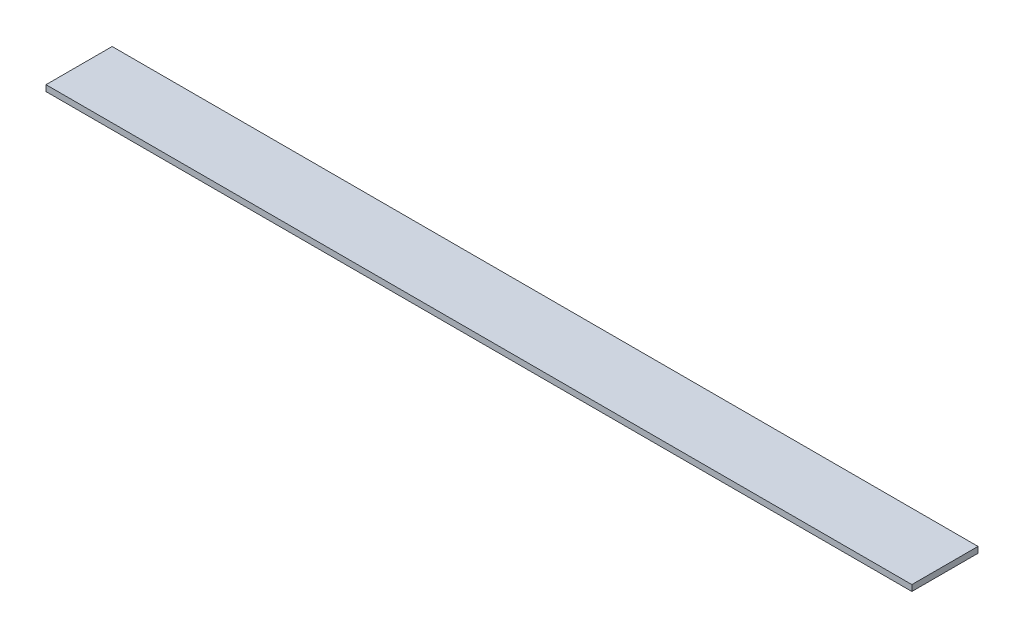
ISO-10303-21;
HEADER;
FILE_DESCRIPTION(('STEP AP214'),'2;1');
FILE_NAME('part.step','',(''),(''),'','','');
FILE_SCHEMA(('AUTOMOTIVE_DESIGN { 1 0 10303 214 1 1 1 1 }'));
ENDSEC;
DATA;
#1=APPLICATION_CONTEXT('core data for automotive mechanical design processes');
#2=APPLICATION_PROTOCOL_DEFINITION('international standard','automotive_design',2000,#1);
#3=PRODUCT_CONTEXT('',#1,'mechanical');
#4=PRODUCT('Part','Part','',(#3));
#5=PRODUCT_RELATED_PRODUCT_CATEGORY('part','',(#4));
#6=PRODUCT_DEFINITION_FORMATION('','',#4);
#7=PRODUCT_DEFINITION_CONTEXT('part definition',#1,'design');
#8=PRODUCT_DEFINITION('design','',#6,#7);
#9=PRODUCT_DEFINITION_SHAPE('','',#8);
#10=(LENGTH_UNIT() NAMED_UNIT(*) SI_UNIT(.MILLI.,.METRE.));
#11=(NAMED_UNIT(*) PLANE_ANGLE_UNIT() SI_UNIT($,.RADIAN.));
#12=(NAMED_UNIT(*) SI_UNIT($,.STERADIAN.) SOLID_ANGLE_UNIT());
#13=UNCERTAINTY_MEASURE_WITH_UNIT(LENGTH_MEASURE(1.E-05),#10,'distance_accuracy_value','');
#14=(GEOMETRIC_REPRESENTATION_CONTEXT(3) GLOBAL_UNCERTAINTY_ASSIGNED_CONTEXT((#13)) GLOBAL_UNIT_ASSIGNED_CONTEXT((#10,
#11,#12)) REPRESENTATION_CONTEXT('',''));
#15=CARTESIAN_POINT('',(0.,0.,0.));
#16=DIRECTION('',(0.,0.,1.));
#17=DIRECTION('',(1.,0.,0.));
#18=AXIS2_PLACEMENT_3D('',#15,#16,#17);
#19=CARTESIAN_POINT('',(-39.5347936844725,12.7,-106.008399092792));
#20=DIRECTION('',(1.,0.,0.));
#21=DIRECTION('',(0.,0.,-1.));
#22=AXIS2_PLACEMENT_3D('',#19,#20,#21);
#23=PLANE('',#22);
#24=DIRECTION('',(0.,0.,1.));
#25=VECTOR('',#24,1.);
#26=CARTESIAN_POINT('',(-39.5347936844725,0.,-106.008399092792));
#27=LINE('',#26,#25);
#28=CARTESIAN_POINT('',(-39.5347936844725,0.,-106.008399092792));
#29=VERTEX_POINT('',#28);
#30=CARTESIAN_POINT('',(-39.5347936844725,0.,33.6916009072077));
#31=VERTEX_POINT('',#30);
#32=EDGE_CURVE('E96',#29,#31,#27,.T.);
#33=ORIENTED_EDGE('',*,*,#32,.T.);
#34=DIRECTION('',(0.,-1.,0.));
#35=VECTOR('',#34,1.);
#36=CARTESIAN_POINT('',(-39.5347936844725,12.7,33.6916009072077));
#37=LINE('',#36,#35);
#38=CARTESIAN_POINT('',(-39.5347936844725,12.7,33.6916009072077));
#39=VERTEX_POINT('',#38);
#40=EDGE_CURVE('E11',#39,#31,#37,.T.);
#41=ORIENTED_EDGE('',*,*,#40,.F.);
#42=DIRECTION('',(0.,0.,1.));
#43=VECTOR('',#42,1.);
#44=CARTESIAN_POINT('',(-39.5347936844725,12.7,-106.008399092792));
#45=LINE('',#44,#43);
#46=CARTESIAN_POINT('',(-39.5347936844725,12.7,-106.008399092792));
#47=VERTEX_POINT('',#46);
#48=EDGE_CURVE('E84',#47,#39,#45,.T.);
#49=ORIENTED_EDGE('',*,*,#48,.F.);
#50=DIRECTION('',(0.,-1.,0.));
#51=VECTOR('',#50,1.);
#52=CARTESIAN_POINT('',(-39.5347936844725,12.7,-106.008399092792));
#53=LINE('',#52,#51);
#54=EDGE_CURVE('E92',#47,#29,#53,.T.);
#55=ORIENTED_EDGE('',*,*,#54,.T.);
#56=EDGE_LOOP('',(#33,#41,#49,#55));
#57=FACE_BOUND('',#56,.T.);
#58=ADVANCED_FACE('F33',(#57),#23,.F.);
#59=CARTESIAN_POINT('',(-39.5347936844725,12.7,33.6916009072077));
#60=DIRECTION('',(0.,0.,-1.));
#61=DIRECTION('',(-1.,0.,0.));
#62=AXIS2_PLACEMENT_3D('',#59,#60,#61);
#63=PLANE('',#62);
#64=DIRECTION('',(1.,0.,0.));
#65=VECTOR('',#64,1.);
#66=CARTESIAN_POINT('',(-39.5347936844725,0.,33.6916009072077));
#67=LINE('',#66,#65);
#68=CARTESIAN_POINT('',(1789.26520631553,0.,33.6916009072077));
#69=VERTEX_POINT('',#68);
#70=EDGE_CURVE('E88',#31,#69,#67,.T.);
#71=ORIENTED_EDGE('',*,*,#70,.T.);
#72=DIRECTION('',(0.,-1.,0.));
#73=VECTOR('',#72,1.);
#74=CARTESIAN_POINT('',(1789.26520631553,12.7,33.6916009072077));
#75=LINE('',#74,#73);
#76=CARTESIAN_POINT('',(1789.26520631553,12.7,33.6916009072077));
#77=VERTEX_POINT('',#76);
#78=EDGE_CURVE('E41',#77,#69,#75,.T.);
#79=ORIENTED_EDGE('',*,*,#78,.F.);
#80=DIRECTION('',(1.,0.,0.));
#81=VECTOR('',#80,1.);
#82=CARTESIAN_POINT('',(-39.5347936844725,12.7,33.6916009072077));
#83=LINE('',#82,#81);
#84=EDGE_CURVE('E79',#39,#77,#83,.T.);
#85=ORIENTED_EDGE('',*,*,#84,.F.);
#86=ORIENTED_EDGE('',*,*,#40,.T.);
#87=EDGE_LOOP('',(#71,#79,#85,#86));
#88=FACE_BOUND('',#87,.T.);
#89=ADVANCED_FACE('F87',(#88),#63,.F.);
#90=CARTESIAN_POINT('',(1789.26520631553,12.7,-106.008399092792));
#91=DIRECTION('',(-1.,0.,0.));
#92=DIRECTION('',(0.,0.,1.));
#93=AXIS2_PLACEMENT_3D('',#90,#91,#92);
#94=PLANE('',#93);
#95=DIRECTION('',(0.,0.,-1.));
#96=VECTOR('',#95,1.);
#97=CARTESIAN_POINT('',(1789.26520631553,0.,-106.008399092792));
#98=LINE('',#97,#96);
#99=CARTESIAN_POINT('',(1789.26520631553,0.,-106.008399092792));
#100=VERTEX_POINT('',#99);
#101=EDGE_CURVE('E66',#69,#100,#98,.T.);
#102=ORIENTED_EDGE('',*,*,#101,.T.);
#103=DIRECTION('',(0.,-1.,0.));
#104=VECTOR('',#103,1.);
#105=CARTESIAN_POINT('',(1789.26520631553,12.7,-106.008399092792));
#106=LINE('',#105,#104);
#107=CARTESIAN_POINT('',(1789.26520631553,12.7,-106.008399092792));
#108=VERTEX_POINT('',#107);
#109=EDGE_CURVE('E89',#108,#100,#106,.T.);
#110=ORIENTED_EDGE('',*,*,#109,.F.);
#111=DIRECTION('',(0.,0.,-1.));
#112=VECTOR('',#111,1.);
#113=CARTESIAN_POINT('',(1789.26520631553,12.7,-106.008399092792));
#114=LINE('',#113,#112);
#115=EDGE_CURVE('E82',#77,#108,#114,.T.);
#116=ORIENTED_EDGE('',*,*,#115,.F.);
#117=ORIENTED_EDGE('',*,*,#78,.T.);
#118=EDGE_LOOP('',(#102,#110,#116,#117));
#119=FACE_BOUND('',#118,.T.);
#120=ADVANCED_FACE('F90',(#119),#94,.F.);
#121=CARTESIAN_POINT('',(-39.5347936844725,12.7,-106.008399092792));
#122=DIRECTION('',(0.,0.,1.));
#123=DIRECTION('',(1.,0.,0.));
#124=AXIS2_PLACEMENT_3D('',#121,#122,#123);
#125=PLANE('',#124);
#126=DIRECTION('',(-1.,0.,0.));
#127=VECTOR('',#126,1.);
#128=CARTESIAN_POINT('',(-39.5347936844725,0.,-106.008399092792));
#129=LINE('',#128,#127);
#130=EDGE_CURVE('E72',#100,#29,#129,.T.);
#131=ORIENTED_EDGE('',*,*,#130,.T.);
#132=ORIENTED_EDGE('',*,*,#54,.F.);
#133=DIRECTION('',(-1.,0.,0.));
#134=VECTOR('',#133,1.);
#135=CARTESIAN_POINT('',(-39.5347936844725,12.7,-106.008399092792));
#136=LINE('',#135,#134);
#137=EDGE_CURVE('E49',#108,#47,#136,.T.);
#138=ORIENTED_EDGE('',*,*,#137,.F.);
#139=ORIENTED_EDGE('',*,*,#109,.T.);
#140=EDGE_LOOP('',(#131,#132,#138,#139));
#141=FACE_BOUND('',#140,.T.);
#142=ADVANCED_FACE('F103',(#141),#125,.F.);
#143=CARTESIAN_POINT('',(0.,12.7,0.));
#144=DIRECTION('',(0.,1.,0.));
#145=DIRECTION('',(0.,0.,1.));
#146=AXIS2_PLACEMENT_3D('',#143,#144,#145);
#147=PLANE('',#146);
#148=ORIENTED_EDGE('',*,*,#48,.T.);
#149=ORIENTED_EDGE('',*,*,#84,.T.);
#150=ORIENTED_EDGE('',*,*,#115,.T.);
#151=ORIENTED_EDGE('',*,*,#137,.T.);
#152=EDGE_LOOP('',(#148,#149,#150,#151));
#153=FACE_BOUND('',#152,.T.);
#154=ADVANCED_FACE('F80',(#153),#147,.T.);
#155=CARTESIAN_POINT('',(0.,0.,0.));
#156=DIRECTION('',(0.,1.,0.));
#157=DIRECTION('',(0.,0.,1.));
#158=AXIS2_PLACEMENT_3D('',#155,#156,#157);
#159=PLANE('',#158);
#160=ORIENTED_EDGE('',*,*,#32,.F.);
#161=ORIENTED_EDGE('',*,*,#130,.F.);
#162=ORIENTED_EDGE('',*,*,#101,.F.);
#163=ORIENTED_EDGE('',*,*,#70,.F.);
#164=EDGE_LOOP('',(#160,#161,#162,#163));
#165=FACE_BOUND('',#164,.T.);
#166=ADVANCED_FACE('F106',(#165),#159,.F.);
#167=CLOSED_SHELL('',(#58,#89,#120,#142,#154,#166));
#168=MANIFOLD_SOLID_BREP('B2',#167);
#169=ADVANCED_BREP_SHAPE_REPRESENTATION('',(#18,#168),#14);
#170=SHAPE_DEFINITION_REPRESENTATION(#9,#169);
ENDSEC;
END-ISO-10303-21;
